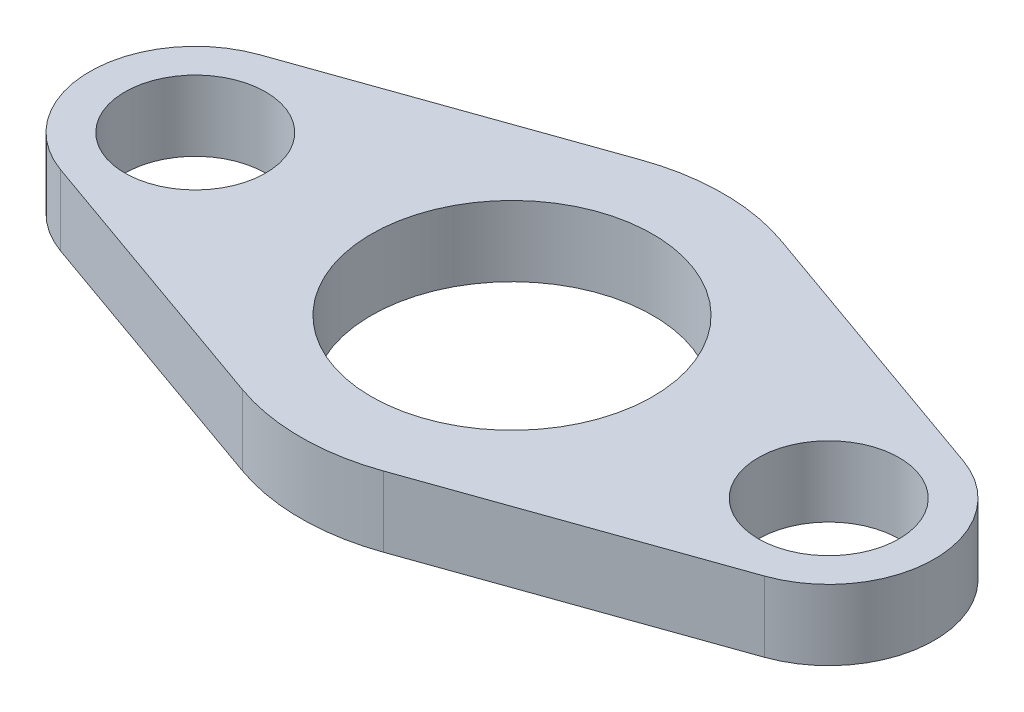
ISO-10303-21;
HEADER;
FILE_DESCRIPTION(('STEP AP214'),'2;1');
FILE_NAME('part.step','',(''),(''),'','','');
FILE_SCHEMA(('AUTOMOTIVE_DESIGN { 1 0 10303 214 1 1 1 1 }'));
ENDSEC;
DATA;
#1=APPLICATION_CONTEXT('core data for automotive mechanical design processes');
#2=APPLICATION_PROTOCOL_DEFINITION('international standard','automotive_design',2000,#1);
#3=PRODUCT_CONTEXT('',#1,'mechanical');
#4=PRODUCT('Part','Part','',(#3));
#5=PRODUCT_RELATED_PRODUCT_CATEGORY('part','',(#4));
#6=PRODUCT_DEFINITION_FORMATION('','',#4);
#7=PRODUCT_DEFINITION_CONTEXT('part definition',#1,'design');
#8=PRODUCT_DEFINITION('design','',#6,#7);
#9=PRODUCT_DEFINITION_SHAPE('','',#8);
#10=(LENGTH_UNIT() NAMED_UNIT(*) SI_UNIT(.MILLI.,.METRE.));
#11=(NAMED_UNIT(*) PLANE_ANGLE_UNIT() SI_UNIT($,.RADIAN.));
#12=(NAMED_UNIT(*) SI_UNIT($,.STERADIAN.) SOLID_ANGLE_UNIT());
#13=UNCERTAINTY_MEASURE_WITH_UNIT(LENGTH_MEASURE(1.E-05),#10,'distance_accuracy_value','');
#14=(GEOMETRIC_REPRESENTATION_CONTEXT(3) GLOBAL_UNCERTAINTY_ASSIGNED_CONTEXT((#13)) GLOBAL_UNIT_ASSIGNED_CONTEXT((#10,
#11,#12)) REPRESENTATION_CONTEXT('',''));
#15=CARTESIAN_POINT('',(0.,0.,0.));
#16=DIRECTION('',(0.,0.,1.));
#17=DIRECTION('',(1.,0.,0.));
#18=AXIS2_PLACEMENT_3D('',#15,#16,#17);
#19=CARTESIAN_POINT('',(45.,10.,0.));
#20=DIRECTION('',(0.,1.,0.));
#21=DIRECTION('',(0.,0.,1.));
#22=AXIS2_PLACEMENT_3D('',#19,#20,#21);
#23=PLANE('',#22);
#24=CARTESIAN_POINT('',(45.,10.,0.));
#25=DIRECTION('',(0.,1.,0.));
#26=DIRECTION('',(0.,0.,1.));
#27=AXIS2_PLACEMENT_3D('',#24,#25,#26);
#28=CIRCLE('',#27,9.99999999999999);
#29=CARTESIAN_POINT('',(45.,10.,9.99999999999999));
#30=VERTEX_POINT('',#29);
#31=EDGE_CURVE('E213',#30,#30,#28,.T.);
#32=ORIENTED_EDGE('',*,*,#31,.F.);
#33=EDGE_LOOP('',(#32));
#34=FACE_BOUND('',#33,.T.);
#35=CARTESIAN_POINT('',(45.,10.,0.));
#36=DIRECTION('',(0.,1.,0.));
#37=DIRECTION('',(0.,0.,1.));
#38=AXIS2_PLACEMENT_3D('',#35,#36,#37);
#39=CIRCLE('',#38,15.);
#40=CARTESIAN_POINT('',(50.,10.,14.142135623731));
#41=VERTEX_POINT('',#40);
#42=CARTESIAN_POINT('',(50.,10.,-14.142135623731));
#43=VERTEX_POINT('',#42);
#44=EDGE_CURVE('E164',#41,#43,#39,.T.);
#45=ORIENTED_EDGE('',*,*,#44,.T.);
#46=DIRECTION('',(-0.942809041582063,0.,-0.333333333333333));
#47=VECTOR('',#46,1.);
#48=CARTESIAN_POINT('',(9.99999999999999,10.,-28.2842712474619));
#49=LINE('',#48,#47);
#50=CARTESIAN_POINT('',(9.99999999999999,10.,-28.2842712474619));
#51=VERTEX_POINT('',#50);
#52=EDGE_CURVE('E100',#43,#51,#49,.T.);
#53=ORIENTED_EDGE('',*,*,#52,.T.);
#54=CARTESIAN_POINT('',(0.,10.,0.));
#55=DIRECTION('',(0.,1.,0.));
#56=DIRECTION('',(0.,0.,1.));
#57=AXIS2_PLACEMENT_3D('',#54,#55,#56);
#58=CIRCLE('',#57,30.);
#59=CARTESIAN_POINT('',(-9.99999999999999,10.,-28.2842712474619));
#60=VERTEX_POINT('',#59);
#61=EDGE_CURVE('E185',#51,#60,#58,.T.);
#62=ORIENTED_EDGE('',*,*,#61,.T.);
#63=DIRECTION('',(-0.942809041582063,0.,0.333333333333333));
#64=VECTOR('',#63,1.);
#65=CARTESIAN_POINT('',(-9.99999999999999,10.,-28.2842712474619));
#66=LINE('',#65,#64);
#67=CARTESIAN_POINT('',(-50.,10.,-14.1421356237309));
#68=VERTEX_POINT('',#67);
#69=EDGE_CURVE('E199',#60,#68,#66,.T.);
#70=ORIENTED_EDGE('',*,*,#69,.T.);
#71=CARTESIAN_POINT('',(-45.,10.,0.));
#72=DIRECTION('',(0.,1.,0.));
#73=DIRECTION('',(0.,0.,-1.));
#74=AXIS2_PLACEMENT_3D('',#71,#72,#73);
#75=CIRCLE('',#74,15.);
#76=CARTESIAN_POINT('',(-50.,10.,14.142135623731));
#77=VERTEX_POINT('',#76);
#78=EDGE_CURVE('E119',#68,#77,#75,.T.);
#79=ORIENTED_EDGE('',*,*,#78,.T.);
#80=DIRECTION('',(0.942809041582063,0.,0.333333333333333));
#81=VECTOR('',#80,1.);
#82=CARTESIAN_POINT('',(-50.,10.,14.142135623731));
#83=LINE('',#82,#81);
#84=CARTESIAN_POINT('',(-9.99999999999999,10.,28.2842712474619));
#85=VERTEX_POINT('',#84);
#86=EDGE_CURVE('E113',#77,#85,#83,.T.);
#87=ORIENTED_EDGE('',*,*,#86,.T.);
#88=CARTESIAN_POINT('',(0.,10.,0.));
#89=DIRECTION('',(0.,1.,0.));
#90=DIRECTION('',(0.,0.,1.));
#91=AXIS2_PLACEMENT_3D('',#88,#89,#90);
#92=CIRCLE('',#91,30.);
#93=CARTESIAN_POINT('',(9.99999999999999,10.,28.2842712474619));
#94=VERTEX_POINT('',#93);
#95=EDGE_CURVE('E117',#85,#94,#92,.T.);
#96=ORIENTED_EDGE('',*,*,#95,.T.);
#97=DIRECTION('',(0.942809041582063,0.,-0.333333333333333));
#98=VECTOR('',#97,1.);
#99=CARTESIAN_POINT('',(9.99999999999999,10.,28.2842712474619));
#100=LINE('',#99,#98);
#101=EDGE_CURVE('E57',#94,#41,#100,.T.);
#102=ORIENTED_EDGE('',*,*,#101,.T.);
#103=EDGE_LOOP('',(#45,#53,#62,#70,#79,#87,#96,#102));
#104=FACE_BOUND('',#103,.T.);
#105=CARTESIAN_POINT('',(0.,10.,0.));
#106=DIRECTION('',(0.,1.,0.));
#107=DIRECTION('',(0.,0.,1.));
#108=AXIS2_PLACEMENT_3D('',#105,#106,#107);
#109=CIRCLE('',#108,20.);
#110=CARTESIAN_POINT('',(0.,10.,20.));
#111=VERTEX_POINT('',#110);
#112=EDGE_CURVE('E146',#111,#111,#109,.T.);
#113=ORIENTED_EDGE('',*,*,#112,.F.);
#114=EDGE_LOOP('',(#113));
#115=FACE_BOUND('',#114,.T.);
#116=CARTESIAN_POINT('',(-45.,10.,0.));
#117=DIRECTION('',(0.,1.,0.));
#118=DIRECTION('',(0.,0.,-1.));
#119=AXIS2_PLACEMENT_3D('',#116,#117,#118);
#120=CIRCLE('',#119,9.99999999999999);
#121=CARTESIAN_POINT('',(-45.,10.,-10.));
#122=VERTEX_POINT('',#121);
#123=EDGE_CURVE('E221',#122,#122,#120,.T.);
#124=ORIENTED_EDGE('',*,*,#123,.F.);
#125=EDGE_LOOP('',(#124));
#126=FACE_BOUND('',#125,.T.);
#127=ADVANCED_FACE('F39',(#34,#104,#115,#126),#23,.T.);
#128=CARTESIAN_POINT('',(45.,0.,0.));
#129=DIRECTION('',(0.,1.,0.));
#130=DIRECTION('',(0.,0.,1.));
#131=AXIS2_PLACEMENT_3D('',#128,#129,#130);
#132=PLANE('',#131);
#133=CARTESIAN_POINT('',(45.,0.,0.));
#134=DIRECTION('',(0.,1.,0.));
#135=DIRECTION('',(0.,0.,1.));
#136=AXIS2_PLACEMENT_3D('',#133,#134,#135);
#137=CIRCLE('',#136,15.);
#138=CARTESIAN_POINT('',(50.,0.,14.142135623731));
#139=VERTEX_POINT('',#138);
#140=CARTESIAN_POINT('',(50.,0.,-14.142135623731));
#141=VERTEX_POINT('',#140);
#142=EDGE_CURVE('E141',#139,#141,#137,.T.);
#143=ORIENTED_EDGE('',*,*,#142,.F.);
#144=DIRECTION('',(0.942809041582063,0.,-0.333333333333333));
#145=VECTOR('',#144,1.);
#146=CARTESIAN_POINT('',(9.99999999999999,0.,28.2842712474619));
#147=LINE('',#146,#145);
#148=CARTESIAN_POINT('',(9.99999999999999,0.,28.2842712474619));
#149=VERTEX_POINT('',#148);
#150=EDGE_CURVE('E92',#149,#139,#147,.T.);
#151=ORIENTED_EDGE('',*,*,#150,.F.);
#152=CARTESIAN_POINT('',(0.,0.,0.));
#153=DIRECTION('',(0.,1.,0.));
#154=DIRECTION('',(0.,0.,1.));
#155=AXIS2_PLACEMENT_3D('',#152,#153,#154);
#156=CIRCLE('',#155,30.);
#157=CARTESIAN_POINT('',(-9.99999999999999,0.,28.2842712474619));
#158=VERTEX_POINT('',#157);
#159=EDGE_CURVE('E86',#158,#149,#156,.T.);
#160=ORIENTED_EDGE('',*,*,#159,.F.);
#161=DIRECTION('',(0.942809041582063,0.,0.333333333333333));
#162=VECTOR('',#161,1.);
#163=CARTESIAN_POINT('',(-50.,0.,14.142135623731));
#164=LINE('',#163,#162);
#165=CARTESIAN_POINT('',(-50.,0.,14.142135623731));
#166=VERTEX_POINT('',#165);
#167=EDGE_CURVE('E128',#166,#158,#164,.T.);
#168=ORIENTED_EDGE('',*,*,#167,.F.);
#169=CARTESIAN_POINT('',(-45.,0.,0.));
#170=DIRECTION('',(0.,1.,0.));
#171=DIRECTION('',(0.,0.,-1.));
#172=AXIS2_PLACEMENT_3D('',#169,#170,#171);
#173=CIRCLE('',#172,15.);
#174=CARTESIAN_POINT('',(-50.,0.,-14.1421356237309));
#175=VERTEX_POINT('',#174);
#176=EDGE_CURVE('E155',#175,#166,#173,.T.);
#177=ORIENTED_EDGE('',*,*,#176,.F.);
#178=DIRECTION('',(-0.942809041582063,0.,0.333333333333333));
#179=VECTOR('',#178,1.);
#180=CARTESIAN_POINT('',(-9.99999999999999,0.,-28.2842712474619));
#181=LINE('',#180,#179);
#182=CARTESIAN_POINT('',(-9.99999999999999,0.,-28.2842712474619));
#183=VERTEX_POINT('',#182);
#184=EDGE_CURVE('E152',#183,#175,#181,.T.);
#185=ORIENTED_EDGE('',*,*,#184,.F.);
#186=CARTESIAN_POINT('',(0.,0.,0.));
#187=DIRECTION('',(0.,1.,0.));
#188=DIRECTION('',(0.,0.,1.));
#189=AXIS2_PLACEMENT_3D('',#186,#187,#188);
#190=CIRCLE('',#189,30.);
#191=CARTESIAN_POINT('',(9.99999999999999,0.,-28.2842712474619));
#192=VERTEX_POINT('',#191);
#193=EDGE_CURVE('E149',#192,#183,#190,.T.);
#194=ORIENTED_EDGE('',*,*,#193,.F.);
#195=DIRECTION('',(-0.942809041582063,0.,-0.333333333333333));
#196=VECTOR('',#195,1.);
#197=CARTESIAN_POINT('',(9.99999999999999,0.,-28.2842712474619));
#198=LINE('',#197,#196);
#199=EDGE_CURVE('E145',#141,#192,#198,.T.);
#200=ORIENTED_EDGE('',*,*,#199,.F.);
#201=EDGE_LOOP('',(#143,#151,#160,#168,#177,#185,#194,#200));
#202=FACE_BOUND('',#201,.T.);
#203=CARTESIAN_POINT('',(0.,0.,0.));
#204=DIRECTION('',(0.,1.,0.));
#205=DIRECTION('',(0.,0.,1.));
#206=AXIS2_PLACEMENT_3D('',#203,#204,#205);
#207=CIRCLE('',#206,20.);
#208=CARTESIAN_POINT('',(0.,0.,20.));
#209=VERTEX_POINT('',#208);
#210=EDGE_CURVE('E209',#209,#209,#207,.T.);
#211=ORIENTED_EDGE('',*,*,#210,.T.);
#212=EDGE_LOOP('',(#211));
#213=FACE_BOUND('',#212,.T.);
#214=CARTESIAN_POINT('',(45.,0.,0.));
#215=DIRECTION('',(0.,1.,0.));
#216=DIRECTION('',(0.,0.,1.));
#217=AXIS2_PLACEMENT_3D('',#214,#215,#216);
#218=CIRCLE('',#217,9.99999999999999);
#219=CARTESIAN_POINT('',(45.,0.,9.99999999999999));
#220=VERTEX_POINT('',#219);
#221=EDGE_CURVE('E217',#220,#220,#218,.T.);
#222=ORIENTED_EDGE('',*,*,#221,.T.);
#223=EDGE_LOOP('',(#222));
#224=FACE_BOUND('',#223,.T.);
#225=CARTESIAN_POINT('',(-45.,0.,0.));
#226=DIRECTION('',(0.,1.,0.));
#227=DIRECTION('',(0.,0.,-1.));
#228=AXIS2_PLACEMENT_3D('',#225,#226,#227);
#229=CIRCLE('',#228,9.99999999999999);
#230=CARTESIAN_POINT('',(-45.,0.,-10.));
#231=VERTEX_POINT('',#230);
#232=EDGE_CURVE('E225',#231,#231,#229,.T.);
#233=ORIENTED_EDGE('',*,*,#232,.T.);
#234=EDGE_LOOP('',(#233));
#235=FACE_BOUND('',#234,.T.);
#236=ADVANCED_FACE('F189',(#202,#213,#224,#235),#132,.F.);
#237=CARTESIAN_POINT('',(45.,10.,0.));
#238=DIRECTION('',(0.,-1.,0.));
#239=DIRECTION('',(0.,0.,-1.));
#240=AXIS2_PLACEMENT_3D('',#237,#238,#239);
#241=CYLINDRICAL_SURFACE('',#240,15.);
#242=ORIENTED_EDGE('',*,*,#142,.T.);
#243=DIRECTION('',(0.,-1.,0.));
#244=VECTOR('',#243,1.);
#245=CARTESIAN_POINT('',(50.,10.,-14.142135623731));
#246=LINE('',#245,#244);
#247=EDGE_CURVE('E11',#43,#141,#246,.T.);
#248=ORIENTED_EDGE('',*,*,#247,.F.);
#249=ORIENTED_EDGE('',*,*,#44,.F.);
#250=DIRECTION('',(0.,-1.,0.));
#251=VECTOR('',#250,1.);
#252=CARTESIAN_POINT('',(50.,10.,14.142135623731));
#253=LINE('',#252,#251);
#254=EDGE_CURVE('E137',#41,#139,#253,.T.);
#255=ORIENTED_EDGE('',*,*,#254,.T.);
#256=EDGE_LOOP('',(#242,#248,#249,#255));
#257=FACE_BOUND('',#256,.T.);
#258=ADVANCED_FACE('F41',(#257),#241,.T.);
#259=CARTESIAN_POINT('',(9.99999999999999,10.,-28.2842712474619));
#260=DIRECTION('',(-0.333333333333333,0.,0.942809041582063));
#261=DIRECTION('',(0.942809041582063,0.,0.333333333333333));
#262=AXIS2_PLACEMENT_3D('',#259,#260,#261);
#263=PLANE('',#262);
#264=ORIENTED_EDGE('',*,*,#199,.T.);
#265=DIRECTION('',(0.,-1.,0.));
#266=VECTOR('',#265,1.);
#267=CARTESIAN_POINT('',(9.99999999999999,10.,-28.2842712474619));
#268=LINE('',#267,#266);
#269=EDGE_CURVE('E49',#51,#192,#268,.T.);
#270=ORIENTED_EDGE('',*,*,#269,.F.);
#271=ORIENTED_EDGE('',*,*,#52,.F.);
#272=ORIENTED_EDGE('',*,*,#247,.T.);
#273=EDGE_LOOP('',(#264,#270,#271,#272));
#274=FACE_BOUND('',#273,.T.);
#275=ADVANCED_FACE('F260',(#274),#263,.F.);
#276=CARTESIAN_POINT('',(0.,10.,0.));
#277=DIRECTION('',(0.,-1.,0.));
#278=DIRECTION('',(0.,0.,-1.));
#279=AXIS2_PLACEMENT_3D('',#276,#277,#278);
#280=CYLINDRICAL_SURFACE('',#279,30.);
#281=ORIENTED_EDGE('',*,*,#193,.T.);
#282=DIRECTION('',(0.,-1.,0.));
#283=VECTOR('',#282,1.);
#284=CARTESIAN_POINT('',(-9.99999999999999,10.,-28.2842712474619));
#285=LINE('',#284,#283);
#286=EDGE_CURVE('E175',#60,#183,#285,.T.);
#287=ORIENTED_EDGE('',*,*,#286,.F.);
#288=ORIENTED_EDGE('',*,*,#61,.F.);
#289=ORIENTED_EDGE('',*,*,#269,.T.);
#290=EDGE_LOOP('',(#281,#287,#288,#289));
#291=FACE_BOUND('',#290,.T.);
#292=ADVANCED_FACE('F183',(#291),#280,.T.);
#293=CARTESIAN_POINT('',(-9.99999999999999,10.,-28.2842712474619));
#294=DIRECTION('',(0.333333333333333,0.,0.942809041582063));
#295=DIRECTION('',(0.942809041582063,0.,-0.333333333333333));
#296=AXIS2_PLACEMENT_3D('',#293,#294,#295);
#297=PLANE('',#296);
#298=ORIENTED_EDGE('',*,*,#184,.T.);
#299=DIRECTION('',(0.,-1.,0.));
#300=VECTOR('',#299,1.);
#301=CARTESIAN_POINT('',(-50.,10.,-14.1421356237309));
#302=LINE('',#301,#300);
#303=EDGE_CURVE('E171',#68,#175,#302,.T.);
#304=ORIENTED_EDGE('',*,*,#303,.F.);
#305=ORIENTED_EDGE('',*,*,#69,.F.);
#306=ORIENTED_EDGE('',*,*,#286,.T.);
#307=EDGE_LOOP('',(#298,#304,#305,#306));
#308=FACE_BOUND('',#307,.T.);
#309=ADVANCED_FACE('F194',(#308),#297,.F.);
#310=CARTESIAN_POINT('',(-45.,10.,0.));
#311=DIRECTION('',(0.,-1.,0.));
#312=DIRECTION('',(0.,0.,-1.));
#313=AXIS2_PLACEMENT_3D('',#310,#311,#312);
#314=CYLINDRICAL_SURFACE('',#313,15.);
#315=ORIENTED_EDGE('',*,*,#176,.T.);
#316=DIRECTION('',(0.,-1.,0.));
#317=VECTOR('',#316,1.);
#318=CARTESIAN_POINT('',(-50.,10.,14.142135623731));
#319=LINE('',#318,#317);
#320=EDGE_CURVE('E130',#77,#166,#319,.T.);
#321=ORIENTED_EDGE('',*,*,#320,.F.);
#322=ORIENTED_EDGE('',*,*,#78,.F.);
#323=ORIENTED_EDGE('',*,*,#303,.T.);
#324=EDGE_LOOP('',(#315,#321,#322,#323));
#325=FACE_BOUND('',#324,.T.);
#326=ADVANCED_FACE('F197',(#325),#314,.T.);
#327=CARTESIAN_POINT('',(-50.,10.,14.142135623731));
#328=DIRECTION('',(0.333333333333333,0.,-0.942809041582063));
#329=DIRECTION('',(-0.942809041582064,0.,-0.333333333333333));
#330=AXIS2_PLACEMENT_3D('',#327,#328,#329);
#331=PLANE('',#330);
#332=ORIENTED_EDGE('',*,*,#167,.T.);
#333=DIRECTION('',(0.,-1.,0.));
#334=VECTOR('',#333,1.);
#335=CARTESIAN_POINT('',(-9.99999999999999,10.,28.2842712474619));
#336=LINE('',#335,#334);
#337=EDGE_CURVE('E125',#85,#158,#336,.T.);
#338=ORIENTED_EDGE('',*,*,#337,.F.);
#339=ORIENTED_EDGE('',*,*,#86,.F.);
#340=ORIENTED_EDGE('',*,*,#320,.T.);
#341=EDGE_LOOP('',(#332,#338,#339,#340));
#342=FACE_BOUND('',#341,.T.);
#343=ADVANCED_FACE('F126',(#342),#331,.F.);
#344=CARTESIAN_POINT('',(0.,10.,0.));
#345=DIRECTION('',(0.,-1.,0.));
#346=DIRECTION('',(0.,0.,-1.));
#347=AXIS2_PLACEMENT_3D('',#344,#345,#346);
#348=CYLINDRICAL_SURFACE('',#347,30.);
#349=ORIENTED_EDGE('',*,*,#159,.T.);
#350=DIRECTION('',(0.,-1.,0.));
#351=VECTOR('',#350,1.);
#352=CARTESIAN_POINT('',(9.99999999999999,10.,28.2842712474619));
#353=LINE('',#352,#351);
#354=EDGE_CURVE('E131',#94,#149,#353,.T.);
#355=ORIENTED_EDGE('',*,*,#354,.F.);
#356=ORIENTED_EDGE('',*,*,#95,.F.);
#357=ORIENTED_EDGE('',*,*,#337,.T.);
#358=EDGE_LOOP('',(#349,#355,#356,#357));
#359=FACE_BOUND('',#358,.T.);
#360=ADVANCED_FACE('F133',(#359),#348,.T.);
#361=CARTESIAN_POINT('',(9.99999999999999,10.,28.2842712474619));
#362=DIRECTION('',(-0.333333333333333,0.,-0.942809041582063));
#363=DIRECTION('',(-0.942809041582063,0.,0.333333333333333));
#364=AXIS2_PLACEMENT_3D('',#361,#362,#363);
#365=PLANE('',#364);
#366=ORIENTED_EDGE('',*,*,#150,.T.);
#367=ORIENTED_EDGE('',*,*,#254,.F.);
#368=ORIENTED_EDGE('',*,*,#101,.F.);
#369=ORIENTED_EDGE('',*,*,#354,.T.);
#370=EDGE_LOOP('',(#366,#367,#368,#369));
#371=FACE_BOUND('',#370,.T.);
#372=ADVANCED_FACE('F248',(#371),#365,.F.);
#373=CARTESIAN_POINT('',(0.,10.,0.));
#374=DIRECTION('',(0.,-1.,0.));
#375=DIRECTION('',(0.,0.,-1.));
#376=AXIS2_PLACEMENT_3D('',#373,#374,#375);
#377=CYLINDRICAL_SURFACE('',#376,20.);
#378=ORIENTED_EDGE('',*,*,#112,.T.);
#379=EDGE_LOOP('',(#378));
#380=FACE_BOUND('',#379,.T.);
#381=ORIENTED_EDGE('',*,*,#210,.F.);
#382=EDGE_LOOP('',(#381));
#383=FACE_BOUND('',#382,.T.);
#384=ADVANCED_FACE('F245',(#380,#383),#377,.F.);
#385=CARTESIAN_POINT('',(45.,10.,0.));
#386=DIRECTION('',(0.,-1.,0.));
#387=DIRECTION('',(0.,0.,-1.));
#388=AXIS2_PLACEMENT_3D('',#385,#386,#387);
#389=CYLINDRICAL_SURFACE('',#388,9.99999999999999);
#390=ORIENTED_EDGE('',*,*,#31,.T.);
#391=EDGE_LOOP('',(#390));
#392=FACE_BOUND('',#391,.T.);
#393=ORIENTED_EDGE('',*,*,#221,.F.);
#394=EDGE_LOOP('',(#393));
#395=FACE_BOUND('',#394,.T.);
#396=ADVANCED_FACE('F324',(#392,#395),#389,.F.);
#397=CARTESIAN_POINT('',(-45.,10.,0.));
#398=DIRECTION('',(0.,-1.,0.));
#399=DIRECTION('',(0.,0.,-1.));
#400=AXIS2_PLACEMENT_3D('',#397,#398,#399);
#401=CYLINDRICAL_SURFACE('',#400,9.99999999999999);
#402=ORIENTED_EDGE('',*,*,#123,.T.);
#403=EDGE_LOOP('',(#402));
#404=FACE_BOUND('',#403,.T.);
#405=ORIENTED_EDGE('',*,*,#232,.F.);
#406=EDGE_LOOP('',(#405));
#407=FACE_BOUND('',#406,.T.);
#408=ADVANCED_FACE('F233',(#404,#407),#401,.F.);
#409=CLOSED_SHELL('',(#127,#236,#258,#275,#292,#309,#326,#343,#360,#372,#384,#396,#408));
#410=MANIFOLD_SOLID_BREP('B2',#409);
#411=ADVANCED_BREP_SHAPE_REPRESENTATION('',(#18,#410),#14);
#412=SHAPE_DEFINITION_REPRESENTATION(#9,#411);
ENDSEC;
END-ISO-10303-21;
